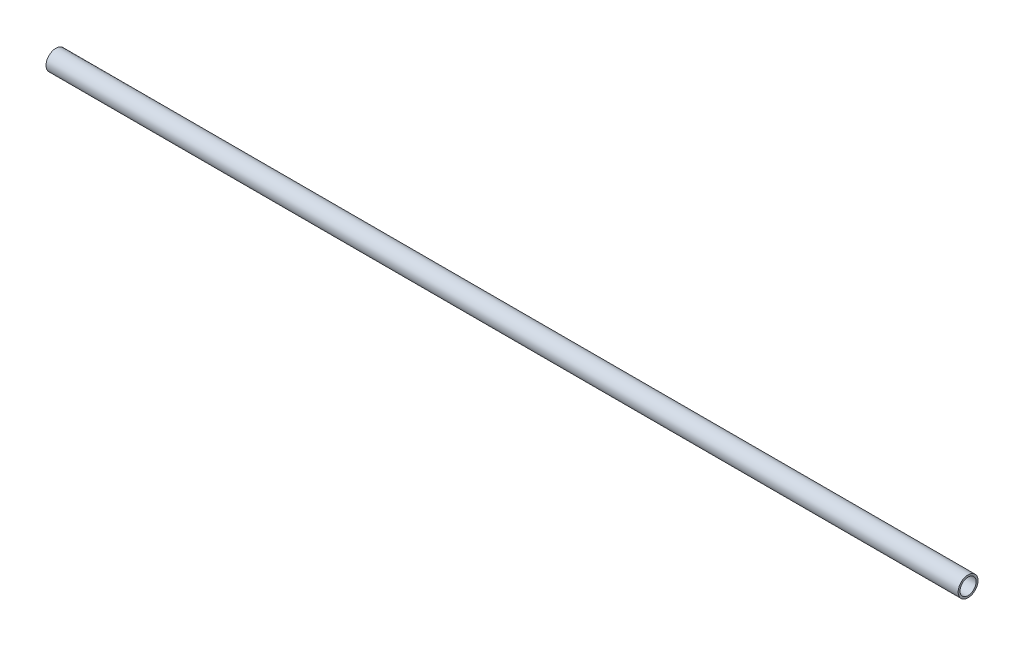
ISO-10303-21;
HEADER;
FILE_DESCRIPTION(('STEP AP214'),'2;1');
FILE_NAME('part.step','',(''),(''),'','','');
FILE_SCHEMA(('AUTOMOTIVE_DESIGN { 1 0 10303 214 1 1 1 1 }'));
ENDSEC;
DATA;
#1=APPLICATION_CONTEXT('core data for automotive mechanical design processes');
#2=APPLICATION_PROTOCOL_DEFINITION('international standard','automotive_design',2000,#1);
#3=PRODUCT_CONTEXT('',#1,'mechanical');
#4=PRODUCT('Part','Part','',(#3));
#5=PRODUCT_RELATED_PRODUCT_CATEGORY('part','',(#4));
#6=PRODUCT_DEFINITION_FORMATION('','',#4);
#7=PRODUCT_DEFINITION_CONTEXT('part definition',#1,'design');
#8=PRODUCT_DEFINITION('design','',#6,#7);
#9=PRODUCT_DEFINITION_SHAPE('','',#8);
#10=(LENGTH_UNIT() NAMED_UNIT(*) SI_UNIT(.MILLI.,.METRE.));
#11=(NAMED_UNIT(*) PLANE_ANGLE_UNIT() SI_UNIT($,.RADIAN.));
#12=(NAMED_UNIT(*) SI_UNIT($,.STERADIAN.) SOLID_ANGLE_UNIT());
#13=UNCERTAINTY_MEASURE_WITH_UNIT(LENGTH_MEASURE(1.E-05),#10,'distance_accuracy_value','');
#14=(GEOMETRIC_REPRESENTATION_CONTEXT(3) GLOBAL_UNCERTAINTY_ASSIGNED_CONTEXT((#13)) GLOBAL_UNIT_ASSIGNED_CONTEXT((#10,
#11,#12)) REPRESENTATION_CONTEXT('',''));
#15=CARTESIAN_POINT('',(0.,0.,0.));
#16=DIRECTION('',(0.,0.,1.));
#17=DIRECTION('',(1.,0.,0.));
#18=AXIS2_PLACEMENT_3D('',#15,#16,#17);
#19=CARTESIAN_POINT('',(612.775,0.,0.));
#20=DIRECTION('',(-1.,0.,0.));
#21=DIRECTION('',(0.,0.,1.));
#22=AXIS2_PLACEMENT_3D('',#19,#20,#21);
#23=CYLINDRICAL_SURFACE('',#22,10.795);
#24=CARTESIAN_POINT('',(-612.775,0.,0.));
#25=DIRECTION('',(-1.,0.,0.));
#26=DIRECTION('',(0.,0.,1.));
#27=AXIS2_PLACEMENT_3D('',#24,#25,#26);
#28=CIRCLE('',#27,10.795);
#29=CARTESIAN_POINT('',(-612.775,0.,10.795));
#30=VERTEX_POINT('',#29);
#31=EDGE_CURVE('E27',#30,#30,#28,.T.);
#32=ORIENTED_EDGE('',*,*,#31,.T.);
#33=EDGE_LOOP('',(#32));
#34=FACE_BOUND('',#33,.T.);
#35=CARTESIAN_POINT('',(612.775,0.,0.));
#36=DIRECTION('',(-1.,0.,0.));
#37=DIRECTION('',(0.,0.,1.));
#38=AXIS2_PLACEMENT_3D('',#35,#36,#37);
#39=CIRCLE('',#38,10.795);
#40=CARTESIAN_POINT('',(612.775,0.,10.795));
#41=VERTEX_POINT('',#40);
#42=EDGE_CURVE('E18',#41,#41,#39,.T.);
#43=ORIENTED_EDGE('',*,*,#42,.F.);
#44=EDGE_LOOP('',(#43));
#45=FACE_BOUND('',#44,.T.);
#46=ADVANCED_FACE('F15',(#34,#45),#23,.F.);
#47=CARTESIAN_POINT('',(612.775,0.,0.));
#48=DIRECTION('',(1.,0.,0.));
#49=DIRECTION('',(0.,0.,-1.));
#50=AXIS2_PLACEMENT_3D('',#47,#48,#49);
#51=PLANE('',#50);
#52=ORIENTED_EDGE('',*,*,#42,.T.);
#53=EDGE_LOOP('',(#52));
#54=FACE_BOUND('',#53,.T.);
#55=CARTESIAN_POINT('',(612.775,0.,0.));
#56=DIRECTION('',(-1.,0.,0.));
#57=DIRECTION('',(0.,0.,1.));
#58=AXIS2_PLACEMENT_3D('',#55,#56,#57);
#59=CIRCLE('',#58,13.335);
#60=CARTESIAN_POINT('',(612.775,0.,13.335));
#61=VERTEX_POINT('',#60);
#62=EDGE_CURVE('E22',#61,#61,#59,.T.);
#63=ORIENTED_EDGE('',*,*,#62,.F.);
#64=EDGE_LOOP('',(#63));
#65=FACE_BOUND('',#64,.T.);
#66=ADVANCED_FACE('F35',(#54,#65),#51,.T.);
#67=CARTESIAN_POINT('',(-612.775,0.,0.));
#68=DIRECTION('',(1.,0.,0.));
#69=DIRECTION('',(0.,0.,-1.));
#70=AXIS2_PLACEMENT_3D('',#67,#68,#69);
#71=PLANE('',#70);
#72=ORIENTED_EDGE('',*,*,#31,.F.);
#73=EDGE_LOOP('',(#72));
#74=FACE_BOUND('',#73,.T.);
#75=CARTESIAN_POINT('',(-612.775,0.,0.));
#76=DIRECTION('',(-1.,0.,0.));
#77=DIRECTION('',(0.,0.,1.));
#78=AXIS2_PLACEMENT_3D('',#75,#76,#77);
#79=CIRCLE('',#78,13.335);
#80=CARTESIAN_POINT('',(-612.775,0.,13.335));
#81=VERTEX_POINT('',#80);
#82=EDGE_CURVE('E10',#81,#81,#79,.F.);
#83=ORIENTED_EDGE('',*,*,#82,.F.);
#84=EDGE_LOOP('',(#83));
#85=FACE_BOUND('',#84,.T.);
#86=ADVANCED_FACE('F43',(#74,#85),#71,.F.);
#87=CARTESIAN_POINT('',(612.775,0.,0.));
#88=DIRECTION('',(-1.,0.,0.));
#89=DIRECTION('',(0.,0.,1.));
#90=AXIS2_PLACEMENT_3D('',#87,#88,#89);
#91=CYLINDRICAL_SURFACE('',#90,13.335);
#92=ORIENTED_EDGE('',*,*,#82,.T.);
#93=EDGE_LOOP('',(#92));
#94=FACE_BOUND('',#93,.T.);
#95=ORIENTED_EDGE('',*,*,#62,.T.);
#96=EDGE_LOOP('',(#95));
#97=FACE_BOUND('',#96,.T.);
#98=ADVANCED_FACE('F44',(#94,#97),#91,.T.);
#99=CLOSED_SHELL('',(#46,#66,#86,#98));
#100=MANIFOLD_SOLID_BREP('B1',#99);
#101=ADVANCED_BREP_SHAPE_REPRESENTATION('',(#18,#100),#14);
#102=SHAPE_DEFINITION_REPRESENTATION(#9,#101);
ENDSEC;
END-ISO-10303-21;
